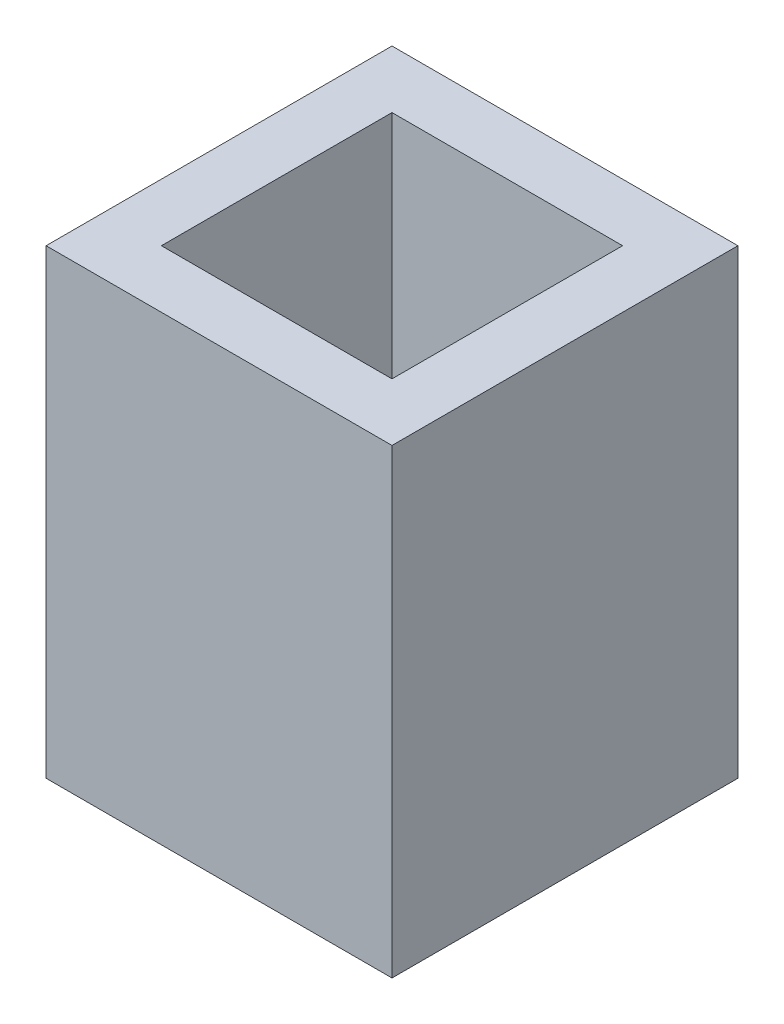
ISO-10303-21;
HEADER;
FILE_DESCRIPTION(('STEP AP214'),'2;1');
FILE_NAME('part.step','',(''),(''),'','','');
FILE_SCHEMA(('AUTOMOTIVE_DESIGN { 1 0 10303 214 1 1 1 1 }'));
ENDSEC;
DATA;
#1=APPLICATION_CONTEXT('core data for automotive mechanical design processes');
#2=APPLICATION_PROTOCOL_DEFINITION('international standard','automotive_design',2000,#1);
#3=PRODUCT_CONTEXT('',#1,'mechanical');
#4=PRODUCT('Part','Part','',(#3));
#5=PRODUCT_RELATED_PRODUCT_CATEGORY('part','',(#4));
#6=PRODUCT_DEFINITION_FORMATION('','',#4);
#7=PRODUCT_DEFINITION_CONTEXT('part definition',#1,'design');
#8=PRODUCT_DEFINITION('design','',#6,#7);
#9=PRODUCT_DEFINITION_SHAPE('','',#8);
#10=(LENGTH_UNIT() NAMED_UNIT(*) SI_UNIT(.MILLI.,.METRE.));
#11=(NAMED_UNIT(*) PLANE_ANGLE_UNIT() SI_UNIT($,.RADIAN.));
#12=(NAMED_UNIT(*) SI_UNIT($,.STERADIAN.) SOLID_ANGLE_UNIT());
#13=UNCERTAINTY_MEASURE_WITH_UNIT(LENGTH_MEASURE(1.E-05),#10,'distance_accuracy_value','');
#14=(GEOMETRIC_REPRESENTATION_CONTEXT(3) GLOBAL_UNCERTAINTY_ASSIGNED_CONTEXT((#13)) GLOBAL_UNIT_ASSIGNED_CONTEXT((#10,
#11,#12)) REPRESENTATION_CONTEXT('',''));
#15=CARTESIAN_POINT('',(0.,0.,0.));
#16=DIRECTION('',(0.,0.,1.));
#17=DIRECTION('',(1.,0.,0.));
#18=AXIS2_PLACEMENT_3D('',#15,#16,#17);
#19=CARTESIAN_POINT('',(0.,25.4,0.));
#20=DIRECTION('',(1.,0.,0.));
#21=DIRECTION('',(0.,0.,-1.));
#22=AXIS2_PLACEMENT_3D('',#19,#20,#21);
#23=PLANE('',#22);
#24=DIRECTION('',(0.,0.,1.));
#25=VECTOR('',#24,1.);
#26=CARTESIAN_POINT('',(0.,0.,0.));
#27=LINE('',#26,#25);
#28=CARTESIAN_POINT('',(0.,0.,-19.05));
#29=VERTEX_POINT('',#28);
#30=CARTESIAN_POINT('',(0.,0.,0.));
#31=VERTEX_POINT('',#30);
#32=EDGE_CURVE('E122',#29,#31,#27,.T.);
#33=ORIENTED_EDGE('',*,*,#32,.T.);
#34=DIRECTION('',(0.,-1.,0.));
#35=VECTOR('',#34,1.);
#36=CARTESIAN_POINT('',(0.,25.4,0.));
#37=LINE('',#36,#35);
#38=CARTESIAN_POINT('',(0.,25.4,0.));
#39=VERTEX_POINT('',#38);
#40=EDGE_CURVE('E151',#39,#31,#37,.T.);
#41=ORIENTED_EDGE('',*,*,#40,.F.);
#42=DIRECTION('',(0.,0.,1.));
#43=VECTOR('',#42,1.);
#44=CARTESIAN_POINT('',(0.,25.4,0.));
#45=LINE('',#44,#43);
#46=CARTESIAN_POINT('',(0.,25.4,-19.05));
#47=VERTEX_POINT('',#46);
#48=EDGE_CURVE('E125',#47,#39,#45,.T.);
#49=ORIENTED_EDGE('',*,*,#48,.F.);
#50=DIRECTION('',(0.,-1.,0.));
#51=VECTOR('',#50,1.);
#52=CARTESIAN_POINT('',(0.,25.4,-19.05));
#53=LINE('',#52,#51);
#54=EDGE_CURVE('E135',#47,#29,#53,.T.);
#55=ORIENTED_EDGE('',*,*,#54,.T.);
#56=EDGE_LOOP('',(#33,#41,#49,#55));
#57=FACE_BOUND('',#56,.T.);
#58=ADVANCED_FACE('F33',(#57),#23,.F.);
#59=CARTESIAN_POINT('',(0.,25.4,0.));
#60=DIRECTION('',(0.,0.,-1.));
#61=DIRECTION('',(-1.,0.,0.));
#62=AXIS2_PLACEMENT_3D('',#59,#60,#61);
#63=PLANE('',#62);
#64=DIRECTION('',(1.,0.,0.));
#65=VECTOR('',#64,1.);
#66=CARTESIAN_POINT('',(0.,0.,0.));
#67=LINE('',#66,#65);
#68=CARTESIAN_POINT('',(19.05,0.,0.));
#69=VERTEX_POINT('',#68);
#70=EDGE_CURVE('E138',#31,#69,#67,.T.);
#71=ORIENTED_EDGE('',*,*,#70,.T.);
#72=DIRECTION('',(0.,-1.,0.));
#73=VECTOR('',#72,1.);
#74=CARTESIAN_POINT('',(19.05,25.4,0.));
#75=LINE('',#74,#73);
#76=CARTESIAN_POINT('',(19.05,25.4,0.));
#77=VERTEX_POINT('',#76);
#78=EDGE_CURVE('E148',#77,#69,#75,.T.);
#79=ORIENTED_EDGE('',*,*,#78,.F.);
#80=DIRECTION('',(1.,0.,0.));
#81=VECTOR('',#80,1.);
#82=CARTESIAN_POINT('',(0.,25.4,0.));
#83=LINE('',#82,#81);
#84=EDGE_CURVE('E128',#39,#77,#83,.T.);
#85=ORIENTED_EDGE('',*,*,#84,.F.);
#86=ORIENTED_EDGE('',*,*,#40,.T.);
#87=EDGE_LOOP('',(#71,#79,#85,#86));
#88=FACE_BOUND('',#87,.T.);
#89=ADVANCED_FACE('F176',(#88),#63,.F.);
#90=CARTESIAN_POINT('',(19.05,25.4,0.));
#91=DIRECTION('',(-1.,0.,0.));
#92=DIRECTION('',(0.,0.,1.));
#93=AXIS2_PLACEMENT_3D('',#90,#91,#92);
#94=PLANE('',#93);
#95=DIRECTION('',(0.,0.,-1.));
#96=VECTOR('',#95,1.);
#97=CARTESIAN_POINT('',(19.05,0.,0.));
#98=LINE('',#97,#96);
#99=CARTESIAN_POINT('',(19.05,0.,-19.05));
#100=VERTEX_POINT('',#99);
#101=EDGE_CURVE('E140',#69,#100,#98,.T.);
#102=ORIENTED_EDGE('',*,*,#101,.T.);
#103=DIRECTION('',(0.,-1.,0.));
#104=VECTOR('',#103,1.);
#105=CARTESIAN_POINT('',(19.05,25.4,-19.05));
#106=LINE('',#105,#104);
#107=CARTESIAN_POINT('',(19.05,25.4,-19.05));
#108=VERTEX_POINT('',#107);
#109=EDGE_CURVE('E145',#108,#100,#106,.T.);
#110=ORIENTED_EDGE('',*,*,#109,.F.);
#111=DIRECTION('',(0.,0.,-1.));
#112=VECTOR('',#111,1.);
#113=CARTESIAN_POINT('',(19.05,25.4,0.));
#114=LINE('',#113,#112);
#115=EDGE_CURVE('E131',#77,#108,#114,.T.);
#116=ORIENTED_EDGE('',*,*,#115,.F.);
#117=ORIENTED_EDGE('',*,*,#78,.T.);
#118=EDGE_LOOP('',(#102,#110,#116,#117));
#119=FACE_BOUND('',#118,.T.);
#120=ADVANCED_FACE('F181',(#119),#94,.F.);
#121=CARTESIAN_POINT('',(0.,25.4,-19.05));
#122=DIRECTION('',(0.,0.,1.));
#123=DIRECTION('',(1.,0.,0.));
#124=AXIS2_PLACEMENT_3D('',#121,#122,#123);
#125=PLANE('',#124);
#126=DIRECTION('',(-1.,0.,0.));
#127=VECTOR('',#126,1.);
#128=CARTESIAN_POINT('',(0.,0.,-19.05));
#129=LINE('',#128,#127);
#130=EDGE_CURVE('E129',#100,#29,#129,.T.);
#131=ORIENTED_EDGE('',*,*,#130,.T.);
#132=ORIENTED_EDGE('',*,*,#54,.F.);
#133=DIRECTION('',(-1.,0.,0.));
#134=VECTOR('',#133,1.);
#135=CARTESIAN_POINT('',(0.,25.4,-19.05));
#136=LINE('',#135,#134);
#137=EDGE_CURVE('E133',#108,#47,#136,.T.);
#138=ORIENTED_EDGE('',*,*,#137,.F.);
#139=ORIENTED_EDGE('',*,*,#109,.T.);
#140=EDGE_LOOP('',(#131,#132,#138,#139));
#141=FACE_BOUND('',#140,.T.);
#142=ADVANCED_FACE('F194',(#141),#125,.F.);
#143=CARTESIAN_POINT('',(0.,25.4,0.));
#144=DIRECTION('',(0.,-1.,0.));
#145=DIRECTION('',(0.,0.,-1.));
#146=AXIS2_PLACEMENT_3D('',#143,#144,#145);
#147=PLANE('',#146);
#148=DIRECTION('',(1.,0.,0.));
#149=VECTOR('',#148,1.);
#150=CARTESIAN_POINT('',(3.175,25.4,-3.175));
#151=LINE('',#150,#149);
#152=CARTESIAN_POINT('',(3.175,25.4,-3.175));
#153=VERTEX_POINT('',#152);
#154=CARTESIAN_POINT('',(15.875,25.4,-3.175));
#155=VERTEX_POINT('',#154);
#156=EDGE_CURVE('E108',#153,#155,#151,.T.);
#157=ORIENTED_EDGE('',*,*,#156,.F.);
#158=DIRECTION('',(0.,0.,1.));
#159=VECTOR('',#158,1.);
#160=CARTESIAN_POINT('',(3.175,25.4,-15.875));
#161=LINE('',#160,#159);
#162=CARTESIAN_POINT('',(3.175,25.4,-15.875));
#163=VERTEX_POINT('',#162);
#164=EDGE_CURVE('E47',#163,#153,#161,.T.);
#165=ORIENTED_EDGE('',*,*,#164,.F.);
#166=DIRECTION('',(-1.,0.,0.));
#167=VECTOR('',#166,1.);
#168=CARTESIAN_POINT('',(3.175,25.4,-15.875));
#169=LINE('',#168,#167);
#170=CARTESIAN_POINT('',(15.875,25.4,-15.875));
#171=VERTEX_POINT('',#170);
#172=EDGE_CURVE('E115',#171,#163,#169,.T.);
#173=ORIENTED_EDGE('',*,*,#172,.F.);
#174=DIRECTION('',(0.,0.,-1.));
#175=VECTOR('',#174,1.);
#176=CARTESIAN_POINT('',(15.875,25.4,-15.875));
#177=LINE('',#176,#175);
#178=EDGE_CURVE('E99',#155,#171,#177,.T.);
#179=ORIENTED_EDGE('',*,*,#178,.F.);
#180=EDGE_LOOP('',(#157,#165,#173,#179));
#181=FACE_BOUND('',#180,.T.);
#182=ORIENTED_EDGE('',*,*,#48,.T.);
#183=ORIENTED_EDGE('',*,*,#84,.T.);
#184=ORIENTED_EDGE('',*,*,#115,.T.);
#185=ORIENTED_EDGE('',*,*,#137,.T.);
#186=EDGE_LOOP('',(#182,#183,#184,#185));
#187=FACE_BOUND('',#186,.T.);
#188=ADVANCED_FACE('F112',(#181,#187),#147,.F.);
#189=CARTESIAN_POINT('',(0.,0.,0.));
#190=DIRECTION('',(0.,-1.,0.));
#191=DIRECTION('',(0.,0.,-1.));
#192=AXIS2_PLACEMENT_3D('',#189,#190,#191);
#193=PLANE('',#192);
#194=DIRECTION('',(0.,0.,-1.));
#195=VECTOR('',#194,1.);
#196=CARTESIAN_POINT('',(3.175,0.,0.));
#197=LINE('',#196,#195);
#198=CARTESIAN_POINT('',(3.175,0.,-3.175));
#199=VERTEX_POINT('',#198);
#200=CARTESIAN_POINT('',(3.175,0.,-15.875));
#201=VERTEX_POINT('',#200);
#202=EDGE_CURVE('E11',#199,#201,#197,.T.);
#203=ORIENTED_EDGE('',*,*,#202,.F.);
#204=DIRECTION('',(-1.,0.,0.));
#205=VECTOR('',#204,1.);
#206=CARTESIAN_POINT('',(0.,0.,-3.175));
#207=LINE('',#206,#205);
#208=CARTESIAN_POINT('',(15.875,0.,-3.175));
#209=VERTEX_POINT('',#208);
#210=EDGE_CURVE('E154',#209,#199,#207,.T.);
#211=ORIENTED_EDGE('',*,*,#210,.F.);
#212=DIRECTION('',(0.,0.,1.));
#213=VECTOR('',#212,1.);
#214=CARTESIAN_POINT('',(15.875,0.,0.));
#215=LINE('',#214,#213);
#216=CARTESIAN_POINT('',(15.875,0.,-15.875));
#217=VERTEX_POINT('',#216);
#218=EDGE_CURVE('E102',#217,#209,#215,.T.);
#219=ORIENTED_EDGE('',*,*,#218,.F.);
#220=DIRECTION('',(1.,0.,0.));
#221=VECTOR('',#220,1.);
#222=CARTESIAN_POINT('',(0.,0.,-15.875));
#223=LINE('',#222,#221);
#224=EDGE_CURVE('E40',#201,#217,#223,.T.);
#225=ORIENTED_EDGE('',*,*,#224,.F.);
#226=EDGE_LOOP('',(#203,#211,#219,#225));
#227=FACE_BOUND('',#226,.T.);
#228=ORIENTED_EDGE('',*,*,#32,.F.);
#229=ORIENTED_EDGE('',*,*,#130,.F.);
#230=ORIENTED_EDGE('',*,*,#101,.F.);
#231=ORIENTED_EDGE('',*,*,#70,.F.);
#232=EDGE_LOOP('',(#228,#229,#230,#231));
#233=FACE_BOUND('',#232,.T.);
#234=ADVANCED_FACE('F162',(#227,#233),#193,.T.);
#235=CARTESIAN_POINT('',(3.175,-381.,-15.875));
#236=DIRECTION('',(-1.,0.,0.));
#237=DIRECTION('',(0.,0.,1.));
#238=AXIS2_PLACEMENT_3D('',#235,#236,#237);
#239=PLANE('',#238);
#240=ORIENTED_EDGE('',*,*,#202,.T.);
#241=DIRECTION('',(0.,1.,0.));
#242=VECTOR('',#241,1.);
#243=CARTESIAN_POINT('',(3.175,-381.,-15.875));
#244=LINE('',#243,#242);
#245=EDGE_CURVE('E120',#201,#163,#244,.T.);
#246=ORIENTED_EDGE('',*,*,#245,.T.);
#247=ORIENTED_EDGE('',*,*,#164,.T.);
#248=DIRECTION('',(0.,1.,0.));
#249=VECTOR('',#248,1.);
#250=CARTESIAN_POINT('',(3.175,-381.,-3.175));
#251=LINE('',#250,#249);
#252=EDGE_CURVE('E105',#199,#153,#251,.T.);
#253=ORIENTED_EDGE('',*,*,#252,.F.);
#254=EDGE_LOOP('',(#240,#246,#247,#253));
#255=FACE_BOUND('',#254,.T.);
#256=ADVANCED_FACE('F164',(#255),#239,.F.);
#257=CARTESIAN_POINT('',(3.175,-381.,-15.875));
#258=DIRECTION('',(0.,0.,-1.));
#259=DIRECTION('',(-1.,0.,0.));
#260=AXIS2_PLACEMENT_3D('',#257,#258,#259);
#261=PLANE('',#260);
#262=ORIENTED_EDGE('',*,*,#224,.T.);
#263=DIRECTION('',(0.,1.,0.));
#264=VECTOR('',#263,1.);
#265=CARTESIAN_POINT('',(15.875,-381.,-15.875));
#266=LINE('',#265,#264);
#267=EDGE_CURVE('E104',#217,#171,#266,.T.);
#268=ORIENTED_EDGE('',*,*,#267,.T.);
#269=ORIENTED_EDGE('',*,*,#172,.T.);
#270=ORIENTED_EDGE('',*,*,#245,.F.);
#271=EDGE_LOOP('',(#262,#268,#269,#270));
#272=FACE_BOUND('',#271,.T.);
#273=ADVANCED_FACE('F159',(#272),#261,.F.);
#274=CARTESIAN_POINT('',(15.875,-381.,-15.875));
#275=DIRECTION('',(1.,0.,0.));
#276=DIRECTION('',(0.,0.,-1.));
#277=AXIS2_PLACEMENT_3D('',#274,#275,#276);
#278=PLANE('',#277);
#279=ORIENTED_EDGE('',*,*,#218,.T.);
#280=DIRECTION('',(0.,1.,0.));
#281=VECTOR('',#280,1.);
#282=CARTESIAN_POINT('',(15.875,-381.,-3.175));
#283=LINE('',#282,#281);
#284=EDGE_CURVE('E55',#209,#155,#283,.T.);
#285=ORIENTED_EDGE('',*,*,#284,.T.);
#286=ORIENTED_EDGE('',*,*,#178,.T.);
#287=ORIENTED_EDGE('',*,*,#267,.F.);
#288=EDGE_LOOP('',(#279,#285,#286,#287));
#289=FACE_BOUND('',#288,.T.);
#290=ADVANCED_FACE('F96',(#289),#278,.F.);
#291=CARTESIAN_POINT('',(3.175,-381.,-3.175));
#292=DIRECTION('',(0.,0.,1.));
#293=DIRECTION('',(1.,0.,0.));
#294=AXIS2_PLACEMENT_3D('',#291,#292,#293);
#295=PLANE('',#294);
#296=ORIENTED_EDGE('',*,*,#210,.T.);
#297=ORIENTED_EDGE('',*,*,#252,.T.);
#298=ORIENTED_EDGE('',*,*,#156,.T.);
#299=ORIENTED_EDGE('',*,*,#284,.F.);
#300=EDGE_LOOP('',(#296,#297,#298,#299));
#301=FACE_BOUND('',#300,.T.);
#302=ADVANCED_FACE('F109',(#301),#295,.F.);
#303=CLOSED_SHELL('',(#58,#89,#120,#142,#188,#234,#256,#273,#290,#302));
#304=MANIFOLD_SOLID_BREP('B2',#303);
#305=ADVANCED_BREP_SHAPE_REPRESENTATION('',(#18,#304),#14);
#306=SHAPE_DEFINITION_REPRESENTATION(#9,#305);
ENDSEC;
END-ISO-10303-21;
